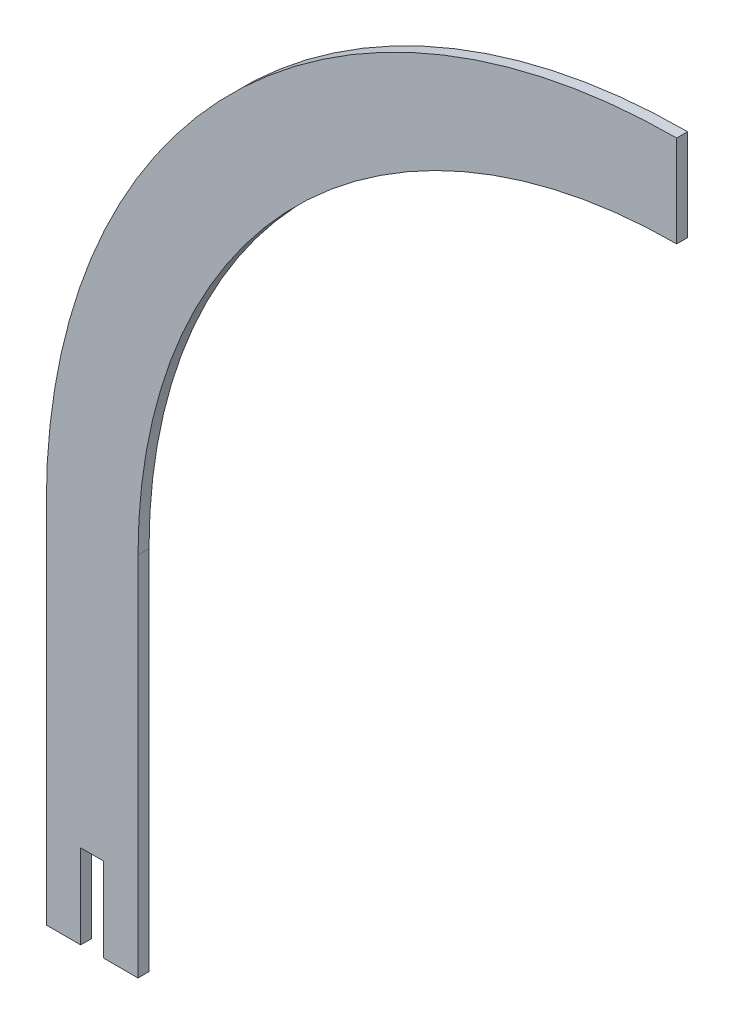
ISO-10303-21;
HEADER;
FILE_DESCRIPTION(('STEP AP214'),'2;1');
FILE_NAME('part.step','',(''),(''),'','','');
FILE_SCHEMA(('AUTOMOTIVE_DESIGN { 1 0 10303 214 1 1 1 1 }'));
ENDSEC;
DATA;
#1=APPLICATION_CONTEXT('core data for automotive mechanical design processes');
#2=APPLICATION_PROTOCOL_DEFINITION('international standard','automotive_design',2000,#1);
#3=PRODUCT_CONTEXT('',#1,'mechanical');
#4=PRODUCT('Part','Part','',(#3));
#5=PRODUCT_RELATED_PRODUCT_CATEGORY('part','',(#4));
#6=PRODUCT_DEFINITION_FORMATION('','',#4);
#7=PRODUCT_DEFINITION_CONTEXT('part definition',#1,'design');
#8=PRODUCT_DEFINITION('design','',#6,#7);
#9=PRODUCT_DEFINITION_SHAPE('','',#8);
#10=(LENGTH_UNIT() NAMED_UNIT(*) SI_UNIT(.MILLI.,.METRE.));
#11=(NAMED_UNIT(*) PLANE_ANGLE_UNIT() SI_UNIT($,.RADIAN.));
#12=(NAMED_UNIT(*) SI_UNIT($,.STERADIAN.) SOLID_ANGLE_UNIT());
#13=UNCERTAINTY_MEASURE_WITH_UNIT(LENGTH_MEASURE(1.E-05),#10,'distance_accuracy_value','');
#14=(GEOMETRIC_REPRESENTATION_CONTEXT(3) GLOBAL_UNCERTAINTY_ASSIGNED_CONTEXT((#13)) GLOBAL_UNIT_ASSIGNED_CONTEXT((#10,
#11,#12)) REPRESENTATION_CONTEXT('',''));
#15=CARTESIAN_POINT('',(0.,0.,0.));
#16=DIRECTION('',(0.,0.,1.));
#17=DIRECTION('',(1.,0.,0.));
#18=AXIS2_PLACEMENT_3D('',#15,#16,#17);
#19=CARTESIAN_POINT('',(-368.315070695091,420.910053656671,18.25625));
#20=DIRECTION('',(0.,0.,-1.));
#21=DIRECTION('',(-1.,0.,0.));
#22=AXIS2_PLACEMENT_3D('',#19,#20,#21);
#23=CYLINDRICAL_SURFACE('',#22,895.35);
#24=CARTESIAN_POINT('',(-368.315070695091,420.910053656671,0.));
#25=DIRECTION('',(0.,0.,1.));
#26=DIRECTION('',(1.,0.,0.));
#27=AXIS2_PLACEMENT_3D('',#24,#25,#26);
#28=CIRCLE('',#27,895.35);
#29=CARTESIAN_POINT('',(-368.315070695091,1316.26005365667,0.));
#30=VERTEX_POINT('',#29);
#31=CARTESIAN_POINT('',(-1263.66507069509,420.91005365667,0.));
#32=VERTEX_POINT('',#31);
#33=EDGE_CURVE('E140',#30,#32,#28,.T.);
#34=ORIENTED_EDGE('',*,*,#33,.F.);
#35=DIRECTION('',(0.,0.,-1.));
#36=VECTOR('',#35,1.);
#37=CARTESIAN_POINT('',(-368.315070695091,1316.26005365667,18.25625));
#38=LINE('',#37,#36);
#39=CARTESIAN_POINT('',(-368.315070695091,1316.26005365667,18.25625));
#40=VERTEX_POINT('',#39);
#41=EDGE_CURVE('E11',#40,#30,#38,.T.);
#42=ORIENTED_EDGE('',*,*,#41,.F.);
#43=CARTESIAN_POINT('',(-368.315070695091,420.910053656671,18.25625));
#44=DIRECTION('',(0.,0.,1.));
#45=DIRECTION('',(1.,0.,0.));
#46=AXIS2_PLACEMENT_3D('',#43,#44,#45);
#47=CIRCLE('',#46,895.35);
#48=CARTESIAN_POINT('',(-1263.66507069509,420.91005365667,18.25625));
#49=VERTEX_POINT('',#48);
#50=EDGE_CURVE('E162',#40,#49,#47,.T.);
#51=ORIENTED_EDGE('',*,*,#50,.T.);
#52=DIRECTION('',(0.,0.,-1.));
#53=VECTOR('',#52,1.);
#54=CARTESIAN_POINT('',(-1263.66507069509,420.91005365667,18.25625));
#55=LINE('',#54,#53);
#56=EDGE_CURVE('E92',#49,#32,#55,.T.);
#57=ORIENTED_EDGE('',*,*,#56,.T.);
#58=EDGE_LOOP('',(#34,#42,#51,#57));
#59=FACE_BOUND('',#58,.T.);
#60=ADVANCED_FACE('F35',(#59),#23,.F.);
#61=CARTESIAN_POINT('',(-368.315070695091,0.,18.25625));
#62=DIRECTION('',(1.,0.,0.));
#63=DIRECTION('',(0.,0.,-1.));
#64=AXIS2_PLACEMENT_3D('',#61,#62,#63);
#65=PLANE('',#64);
#66=DIRECTION('',(0.,-1.,0.));
#67=VECTOR('',#66,1.);
#68=CARTESIAN_POINT('',(-368.315070695091,0.,0.));
#69=LINE('',#68,#67);
#70=CARTESIAN_POINT('',(-368.315070695091,1468.66005365667,0.));
#71=VERTEX_POINT('',#70);
#72=EDGE_CURVE('E143',#71,#30,#69,.T.);
#73=ORIENTED_EDGE('',*,*,#72,.F.);
#74=DIRECTION('',(0.,0.,-1.));
#75=VECTOR('',#74,1.);
#76=CARTESIAN_POINT('',(-368.315070695091,1468.66005365667,18.25625));
#77=LINE('',#76,#75);
#78=CARTESIAN_POINT('',(-368.315070695091,1468.66005365667,18.25625));
#79=VERTEX_POINT('',#78);
#80=EDGE_CURVE('E43',#79,#71,#77,.T.);
#81=ORIENTED_EDGE('',*,*,#80,.F.);
#82=DIRECTION('',(0.,-1.,0.));
#83=VECTOR('',#82,1.);
#84=CARTESIAN_POINT('',(-368.315070695091,0.,18.25625));
#85=LINE('',#84,#83);
#86=EDGE_CURVE('E190',#79,#40,#85,.T.);
#87=ORIENTED_EDGE('',*,*,#86,.T.);
#88=ORIENTED_EDGE('',*,*,#41,.T.);
#89=EDGE_LOOP('',(#73,#81,#87,#88));
#90=FACE_BOUND('',#89,.T.);
#91=ADVANCED_FACE('F189',(#90),#65,.T.);
#92=CARTESIAN_POINT('',(-368.315070695091,420.910053656671,18.25625));
#93=DIRECTION('',(0.,0.,-1.));
#94=DIRECTION('',(-1.,0.,0.));
#95=AXIS2_PLACEMENT_3D('',#92,#93,#94);
#96=CYLINDRICAL_SURFACE('',#95,1047.75);
#97=CARTESIAN_POINT('',(-368.315070695091,420.910053656671,0.));
#98=DIRECTION('',(0.,0.,1.));
#99=DIRECTION('',(1.,0.,0.));
#100=AXIS2_PLACEMENT_3D('',#97,#98,#99);
#101=CIRCLE('',#100,1047.75);
#102=CARTESIAN_POINT('',(-1416.06507069509,420.910053656671,0.));
#103=VERTEX_POINT('',#102);
#104=EDGE_CURVE('E146',#71,#103,#101,.T.);
#105=ORIENTED_EDGE('',*,*,#104,.T.);
#106=DIRECTION('',(0.,0.,-1.));
#107=VECTOR('',#106,1.);
#108=CARTESIAN_POINT('',(-1416.06507069509,420.910053656671,18.25625));
#109=LINE('',#108,#107);
#110=CARTESIAN_POINT('',(-1416.06507069509,420.910053656671,18.25625));
#111=VERTEX_POINT('',#110);
#112=EDGE_CURVE('E173',#111,#103,#109,.T.);
#113=ORIENTED_EDGE('',*,*,#112,.F.);
#114=CARTESIAN_POINT('',(-368.315070695091,420.910053656671,18.25625));
#115=DIRECTION('',(0.,0.,1.));
#116=DIRECTION('',(1.,0.,0.));
#117=AXIS2_PLACEMENT_3D('',#114,#115,#116);
#118=CIRCLE('',#117,1047.75);
#119=EDGE_CURVE('E180',#79,#111,#118,.T.);
#120=ORIENTED_EDGE('',*,*,#119,.F.);
#121=ORIENTED_EDGE('',*,*,#80,.T.);
#122=EDGE_LOOP('',(#105,#113,#120,#121));
#123=FACE_BOUND('',#122,.T.);
#124=ADVANCED_FACE('F178',(#123),#96,.T.);
#125=CARTESIAN_POINT('',(-1416.06507069509,0.,18.25625));
#126=DIRECTION('',(1.,0.,0.));
#127=DIRECTION('',(0.,0.,-1.));
#128=AXIS2_PLACEMENT_3D('',#125,#126,#127);
#129=PLANE('',#128);
#130=DIRECTION('',(0.,-1.,0.));
#131=VECTOR('',#130,1.);
#132=CARTESIAN_POINT('',(-1416.06507069509,0.,0.));
#133=LINE('',#132,#131);
#134=CARTESIAN_POINT('',(-1416.06507069509,-188.062492736699,0.));
#135=VERTEX_POINT('',#134);
#136=EDGE_CURVE('E148',#103,#135,#133,.T.);
#137=ORIENTED_EDGE('',*,*,#136,.T.);
#138=DIRECTION('',(0.,0.,-1.));
#139=VECTOR('',#138,1.);
#140=CARTESIAN_POINT('',(-1416.06507069509,-188.062492736699,18.25625));
#141=LINE('',#140,#139);
#142=CARTESIAN_POINT('',(-1416.06507069509,-188.062492736699,18.25625));
#143=VERTEX_POINT('',#142);
#144=EDGE_CURVE('E170',#143,#135,#141,.T.);
#145=ORIENTED_EDGE('',*,*,#144,.F.);
#146=DIRECTION('',(0.,-1.,0.));
#147=VECTOR('',#146,1.);
#148=CARTESIAN_POINT('',(-1416.06507069509,0.,18.25625));
#149=LINE('',#148,#147);
#150=EDGE_CURVE('E198',#111,#143,#149,.T.);
#151=ORIENTED_EDGE('',*,*,#150,.F.);
#152=ORIENTED_EDGE('',*,*,#112,.T.);
#153=EDGE_LOOP('',(#137,#145,#151,#152));
#154=FACE_BOUND('',#153,.T.);
#155=ADVANCED_FACE('F231',(#154),#129,.F.);
#156=CARTESIAN_POINT('',(0.,-188.062492736699,18.25625));
#157=DIRECTION('',(0.,1.,0.));
#158=DIRECTION('',(0.,0.,1.));
#159=AXIS2_PLACEMENT_3D('',#156,#157,#158);
#160=PLANE('',#159);
#161=DIRECTION('',(1.,0.,0.));
#162=VECTOR('',#161,1.);
#163=CARTESIAN_POINT('',(0.,-188.062492736699,0.));
#164=LINE('',#163,#162);
#165=CARTESIAN_POINT('',(-1358.91507069509,-188.062492736699,0.));
#166=VERTEX_POINT('',#165);
#167=EDGE_CURVE('E150',#135,#166,#164,.T.);
#168=ORIENTED_EDGE('',*,*,#167,.T.);
#169=DIRECTION('',(0.,0.,-1.));
#170=VECTOR('',#169,1.);
#171=CARTESIAN_POINT('',(-1358.91507069509,-188.062492736699,18.25625));
#172=LINE('',#171,#170);
#173=CARTESIAN_POINT('',(-1358.91507069509,-188.062492736699,18.25625));
#174=VERTEX_POINT('',#173);
#175=EDGE_CURVE('E168',#174,#166,#172,.T.);
#176=ORIENTED_EDGE('',*,*,#175,.F.);
#177=DIRECTION('',(1.,0.,0.));
#178=VECTOR('',#177,1.);
#179=CARTESIAN_POINT('',(0.,-188.062492736699,18.25625));
#180=LINE('',#179,#178);
#181=EDGE_CURVE('E200',#143,#174,#180,.T.);
#182=ORIENTED_EDGE('',*,*,#181,.F.);
#183=ORIENTED_EDGE('',*,*,#144,.T.);
#184=EDGE_LOOP('',(#168,#176,#182,#183));
#185=FACE_BOUND('',#184,.T.);
#186=ADVANCED_FACE('F212',(#185),#160,.F.);
#187=CARTESIAN_POINT('',(-1358.91507069509,0.,18.25625));
#188=DIRECTION('',(1.,0.,0.));
#189=DIRECTION('',(0.,0.,-1.));
#190=AXIS2_PLACEMENT_3D('',#187,#188,#189);
#191=PLANE('',#190);
#192=DIRECTION('',(0.,-1.,0.));
#193=VECTOR('',#192,1.);
#194=CARTESIAN_POINT('',(-1358.91507069509,0.,0.));
#195=LINE('',#194,#193);
#196=CARTESIAN_POINT('',(-1358.91507069509,-48.3624927366991,0.));
#197=VERTEX_POINT('',#196);
#198=EDGE_CURVE('E153',#197,#166,#195,.T.);
#199=ORIENTED_EDGE('',*,*,#198,.F.);
#200=DIRECTION('',(0.,0.,-1.));
#201=VECTOR('',#200,1.);
#202=CARTESIAN_POINT('',(-1358.91507069509,-48.3624927366991,18.25625));
#203=LINE('',#202,#201);
#204=CARTESIAN_POINT('',(-1358.91507069509,-48.3624927366991,18.25625));
#205=VERTEX_POINT('',#204);
#206=EDGE_CURVE('E166',#205,#197,#203,.T.);
#207=ORIENTED_EDGE('',*,*,#206,.F.);
#208=DIRECTION('',(0.,-1.,0.));
#209=VECTOR('',#208,1.);
#210=CARTESIAN_POINT('',(-1358.91507069509,0.,18.25625));
#211=LINE('',#210,#209);
#212=EDGE_CURVE('E202',#205,#174,#211,.T.);
#213=ORIENTED_EDGE('',*,*,#212,.T.);
#214=ORIENTED_EDGE('',*,*,#175,.T.);
#215=EDGE_LOOP('',(#199,#207,#213,#214));
#216=FACE_BOUND('',#215,.T.);
#217=ADVANCED_FACE('F206',(#216),#191,.T.);
#218=CARTESIAN_POINT('',(0.,-48.3624927366991,18.25625));
#219=DIRECTION('',(0.,1.,0.));
#220=DIRECTION('',(0.,0.,1.));
#221=AXIS2_PLACEMENT_3D('',#218,#219,#220);
#222=PLANE('',#221);
#223=DIRECTION('',(1.,0.,0.));
#224=VECTOR('',#223,1.);
#225=CARTESIAN_POINT('',(0.,-48.3624927366991,0.));
#226=LINE('',#225,#224);
#227=CARTESIAN_POINT('',(-1320.81507069509,-48.3624927366991,0.));
#228=VERTEX_POINT('',#227);
#229=EDGE_CURVE('E156',#197,#228,#226,.T.);
#230=ORIENTED_EDGE('',*,*,#229,.T.);
#231=DIRECTION('',(0.,0.,-1.));
#232=VECTOR('',#231,1.);
#233=CARTESIAN_POINT('',(-1320.81507069509,-48.3624927366991,18.25625));
#234=LINE('',#233,#232);
#235=CARTESIAN_POINT('',(-1320.81507069509,-48.3624927366991,18.25625));
#236=VERTEX_POINT('',#235);
#237=EDGE_CURVE('E132',#236,#228,#234,.T.);
#238=ORIENTED_EDGE('',*,*,#237,.F.);
#239=DIRECTION('',(1.,0.,0.));
#240=VECTOR('',#239,1.);
#241=CARTESIAN_POINT('',(0.,-48.3624927366991,18.25625));
#242=LINE('',#241,#240);
#243=EDGE_CURVE('E123',#205,#236,#242,.T.);
#244=ORIENTED_EDGE('',*,*,#243,.F.);
#245=ORIENTED_EDGE('',*,*,#206,.T.);
#246=EDGE_LOOP('',(#230,#238,#244,#245));
#247=FACE_BOUND('',#246,.T.);
#248=ADVANCED_FACE('F215',(#247),#222,.F.);
#249=CARTESIAN_POINT('',(-1320.81507069509,0.,18.25625));
#250=DIRECTION('',(1.,0.,0.));
#251=DIRECTION('',(0.,0.,-1.));
#252=AXIS2_PLACEMENT_3D('',#249,#250,#251);
#253=PLANE('',#252);
#254=DIRECTION('',(0.,-1.,0.));
#255=VECTOR('',#254,1.);
#256=CARTESIAN_POINT('',(-1320.81507069509,0.,0.));
#257=LINE('',#256,#255);
#258=CARTESIAN_POINT('',(-1320.81507069509,-188.062492736699,0.));
#259=VERTEX_POINT('',#258);
#260=EDGE_CURVE('E131',#228,#259,#257,.T.);
#261=ORIENTED_EDGE('',*,*,#260,.T.);
#262=DIRECTION('',(0.,0.,-1.));
#263=VECTOR('',#262,1.);
#264=CARTESIAN_POINT('',(-1320.81507069509,-188.062492736699,18.25625));
#265=LINE('',#264,#263);
#266=CARTESIAN_POINT('',(-1320.81507069509,-188.062492736699,18.25625));
#267=VERTEX_POINT('',#266);
#268=EDGE_CURVE('E128',#267,#259,#265,.T.);
#269=ORIENTED_EDGE('',*,*,#268,.F.);
#270=DIRECTION('',(0.,-1.,0.));
#271=VECTOR('',#270,1.);
#272=CARTESIAN_POINT('',(-1320.81507069509,0.,18.25625));
#273=LINE('',#272,#271);
#274=EDGE_CURVE('E116',#236,#267,#273,.T.);
#275=ORIENTED_EDGE('',*,*,#274,.F.);
#276=ORIENTED_EDGE('',*,*,#237,.T.);
#277=EDGE_LOOP('',(#261,#269,#275,#276));
#278=FACE_BOUND('',#277,.T.);
#279=ADVANCED_FACE('F129',(#278),#253,.F.);
#280=CARTESIAN_POINT('',(0.,-188.062492736699,18.25625));
#281=DIRECTION('',(0.,1.,0.));
#282=DIRECTION('',(0.,0.,1.));
#283=AXIS2_PLACEMENT_3D('',#280,#281,#282);
#284=PLANE('',#283);
#285=DIRECTION('',(1.,0.,0.));
#286=VECTOR('',#285,1.);
#287=CARTESIAN_POINT('',(0.,-188.062492736699,0.));
#288=LINE('',#287,#286);
#289=CARTESIAN_POINT('',(-1263.66507069509,-188.062492736699,0.));
#290=VERTEX_POINT('',#289);
#291=EDGE_CURVE('E85',#259,#290,#288,.T.);
#292=ORIENTED_EDGE('',*,*,#291,.T.);
#293=DIRECTION('',(0.,0.,-1.));
#294=VECTOR('',#293,1.);
#295=CARTESIAN_POINT('',(-1263.66507069509,-188.062492736699,18.25625));
#296=LINE('',#295,#294);
#297=CARTESIAN_POINT('',(-1263.66507069509,-188.062492736699,18.25625));
#298=VERTEX_POINT('',#297);
#299=EDGE_CURVE('E133',#298,#290,#296,.T.);
#300=ORIENTED_EDGE('',*,*,#299,.F.);
#301=DIRECTION('',(1.,0.,0.));
#302=VECTOR('',#301,1.);
#303=CARTESIAN_POINT('',(0.,-188.062492736699,18.25625));
#304=LINE('',#303,#302);
#305=EDGE_CURVE('E120',#267,#298,#304,.T.);
#306=ORIENTED_EDGE('',*,*,#305,.F.);
#307=ORIENTED_EDGE('',*,*,#268,.T.);
#308=EDGE_LOOP('',(#292,#300,#306,#307));
#309=FACE_BOUND('',#308,.T.);
#310=ADVANCED_FACE('F135',(#309),#284,.F.);
#311=CARTESIAN_POINT('',(-1263.66507069509,0.,18.25625));
#312=DIRECTION('',(-1.,0.,0.));
#313=DIRECTION('',(0.,0.,1.));
#314=AXIS2_PLACEMENT_3D('',#311,#312,#313);
#315=PLANE('',#314);
#316=DIRECTION('',(0.,1.,0.));
#317=VECTOR('',#316,1.);
#318=CARTESIAN_POINT('',(-1263.66507069509,0.,0.));
#319=LINE('',#318,#317);
#320=EDGE_CURVE('E160',#290,#32,#319,.T.);
#321=ORIENTED_EDGE('',*,*,#320,.T.);
#322=ORIENTED_EDGE('',*,*,#56,.F.);
#323=DIRECTION('',(0.,1.,0.));
#324=VECTOR('',#323,1.);
#325=CARTESIAN_POINT('',(-1263.66507069509,0.,18.25625));
#326=LINE('',#325,#324);
#327=EDGE_CURVE('E51',#298,#49,#326,.T.);
#328=ORIENTED_EDGE('',*,*,#327,.F.);
#329=ORIENTED_EDGE('',*,*,#299,.T.);
#330=EDGE_LOOP('',(#321,#322,#328,#329));
#331=FACE_BOUND('',#330,.T.);
#332=ADVANCED_FACE('F193',(#331),#315,.F.);
#333=CARTESIAN_POINT('',(0.,0.,18.25625));
#334=DIRECTION('',(0.,0.,1.));
#335=DIRECTION('',(1.,0.,0.));
#336=AXIS2_PLACEMENT_3D('',#333,#334,#335);
#337=PLANE('',#336);
#338=ORIENTED_EDGE('',*,*,#50,.F.);
#339=ORIENTED_EDGE('',*,*,#86,.F.);
#340=ORIENTED_EDGE('',*,*,#119,.T.);
#341=ORIENTED_EDGE('',*,*,#150,.T.);
#342=ORIENTED_EDGE('',*,*,#181,.T.);
#343=ORIENTED_EDGE('',*,*,#212,.F.);
#344=ORIENTED_EDGE('',*,*,#243,.T.);
#345=ORIENTED_EDGE('',*,*,#274,.T.);
#346=ORIENTED_EDGE('',*,*,#305,.T.);
#347=ORIENTED_EDGE('',*,*,#327,.T.);
#348=EDGE_LOOP('',(#338,#339,#340,#341,#342,#343,#344,#345,#346,#347));
#349=FACE_BOUND('',#348,.T.);
#350=ADVANCED_FACE('F118',(#349),#337,.T.);
#351=CARTESIAN_POINT('',(0.,0.,0.));
#352=DIRECTION('',(0.,0.,1.));
#353=DIRECTION('',(1.,0.,0.));
#354=AXIS2_PLACEMENT_3D('',#351,#352,#353);
#355=PLANE('',#354);
#356=ORIENTED_EDGE('',*,*,#33,.T.);
#357=ORIENTED_EDGE('',*,*,#320,.F.);
#358=ORIENTED_EDGE('',*,*,#291,.F.);
#359=ORIENTED_EDGE('',*,*,#260,.F.);
#360=ORIENTED_EDGE('',*,*,#229,.F.);
#361=ORIENTED_EDGE('',*,*,#198,.T.);
#362=ORIENTED_EDGE('',*,*,#167,.F.);
#363=ORIENTED_EDGE('',*,*,#136,.F.);
#364=ORIENTED_EDGE('',*,*,#104,.F.);
#365=ORIENTED_EDGE('',*,*,#72,.T.);
#366=EDGE_LOOP('',(#356,#357,#358,#359,#360,#361,#362,#363,#364,#365));
#367=FACE_BOUND('',#366,.T.);
#368=ADVANCED_FACE('F187',(#367),#355,.F.);
#369=CLOSED_SHELL('',(#60,#91,#124,#155,#186,#217,#248,#279,#310,#332,#350,#368));
#370=MANIFOLD_SOLID_BREP('B2',#369);
#371=ADVANCED_BREP_SHAPE_REPRESENTATION('',(#18,#370),#14);
#372=SHAPE_DEFINITION_REPRESENTATION(#9,#371);
ENDSEC;
END-ISO-10303-21;
